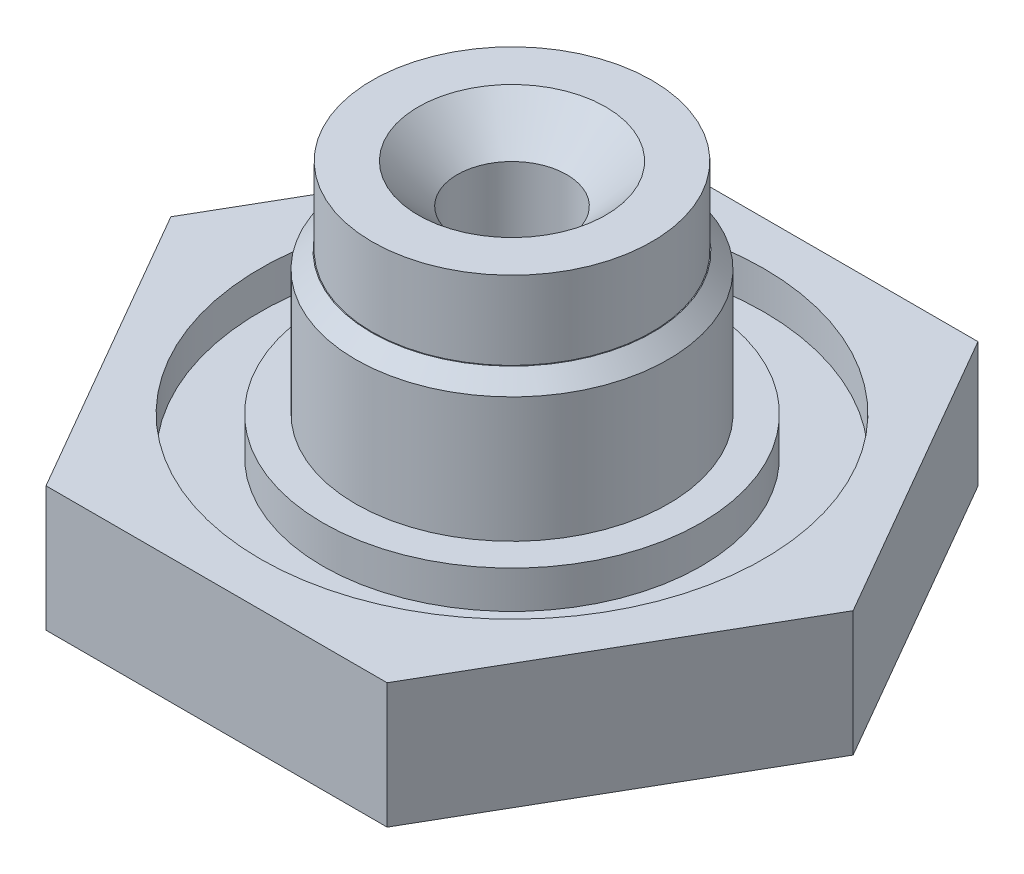
ISO-10303-21;
HEADER;
FILE_DESCRIPTION(('STEP AP214'),'2;1');
FILE_NAME('part.step','',(''),(''),'','','');
FILE_SCHEMA(('AUTOMOTIVE_DESIGN { 1 0 10303 214 1 1 1 1 }'));
ENDSEC;
DATA;
#1=APPLICATION_CONTEXT('core data for automotive mechanical design processes');
#2=APPLICATION_PROTOCOL_DEFINITION('international standard','automotive_design',2000,#1);
#3=PRODUCT_CONTEXT('',#1,'mechanical');
#4=PRODUCT('Part','Part','',(#3));
#5=PRODUCT_RELATED_PRODUCT_CATEGORY('part','',(#4));
#6=PRODUCT_DEFINITION_FORMATION('','',#4);
#7=PRODUCT_DEFINITION_CONTEXT('part definition',#1,'design');
#8=PRODUCT_DEFINITION('design','',#6,#7);
#9=PRODUCT_DEFINITION_SHAPE('','',#8);
#10=(LENGTH_UNIT() NAMED_UNIT(*) SI_UNIT(.MILLI.,.METRE.));
#11=(NAMED_UNIT(*) PLANE_ANGLE_UNIT() SI_UNIT($,.RADIAN.));
#12=(NAMED_UNIT(*) SI_UNIT($,.STERADIAN.) SOLID_ANGLE_UNIT());
#13=UNCERTAINTY_MEASURE_WITH_UNIT(LENGTH_MEASURE(1.E-05),#10,'distance_accuracy_value','');
#14=(GEOMETRIC_REPRESENTATION_CONTEXT(3) GLOBAL_UNCERTAINTY_ASSIGNED_CONTEXT((#13)) GLOBAL_UNIT_ASSIGNED_CONTEXT((#10,
#11,#12)) REPRESENTATION_CONTEXT('',''));
#15=CARTESIAN_POINT('',(0.,0.,0.));
#16=DIRECTION('',(0.,0.,1.));
#17=DIRECTION('',(1.,0.,0.));
#18=AXIS2_PLACEMENT_3D('',#15,#16,#17);
#19=CARTESIAN_POINT('',(5.,9.,0.));
#20=DIRECTION('',(0.,1.,0.));
#21=DIRECTION('',(0.,0.,1.));
#22=AXIS2_PLACEMENT_3D('',#19,#20,#21);
#23=PLANE('',#22);
#24=CARTESIAN_POINT('',(0.,9.,0.));
#25=DIRECTION('',(0.,-1.,0.));
#26=DIRECTION('',(0.,0.,-1.));
#27=AXIS2_PLACEMENT_3D('',#24,#25,#26);
#28=CIRCLE('',#27,5.);
#29=CARTESIAN_POINT('',(0.,9.,-5.));
#30=VERTEX_POINT('',#29);
#31=EDGE_CURVE('E132',#30,#30,#28,.T.);
#32=ORIENTED_EDGE('',*,*,#31,.T.);
#33=EDGE_LOOP('',(#32));
#34=FACE_BOUND('',#33,.T.);
#35=CARTESIAN_POINT('',(0.,9.,0.));
#36=DIRECTION('',(0.,1.,0.));
#37=DIRECTION('',(0.,0.,1.));
#38=AXIS2_PLACEMENT_3D('',#35,#36,#37);
#39=CIRCLE('',#38,6.05);
#40=CARTESIAN_POINT('',(0.,9.,6.05));
#41=VERTEX_POINT('',#40);
#42=EDGE_CURVE('E309',#41,#41,#39,.T.);
#43=ORIENTED_EDGE('',*,*,#42,.T.);
#44=EDGE_LOOP('',(#43));
#45=FACE_BOUND('',#44,.T.);
#46=ADVANCED_FACE('F38',(#34,#45),#23,.T.);
#47=CARTESIAN_POINT('',(0.,9.,0.));
#48=DIRECTION('',(0.,1.,0.));
#49=DIRECTION('',(0.,0.,1.));
#50=AXIS2_PLACEMENT_3D('',#47,#48,#49);
#51=CIRCLE('',#50,8.05);
#52=CARTESIAN_POINT('',(0.,9.,8.05));
#53=VERTEX_POINT('',#52);
#54=EDGE_CURVE('E311',#53,#53,#51,.T.);
#55=ORIENTED_EDGE('',*,*,#54,.F.);
#56=EDGE_LOOP('',(#55));
#57=FACE_BOUND('',#56,.T.);
#58=DIRECTION('',(-0.500000000000004,0.,0.866025403784436));
#59=VECTOR('',#58,1.);
#60=CARTESIAN_POINT('',(-10.911920087684,9.,0.));
#61=LINE('',#60,#59);
#62=CARTESIAN_POINT('',(-5.45596004384195,9.,-9.45000000000004));
#63=VERTEX_POINT('',#62);
#64=CARTESIAN_POINT('',(-10.911920087684,9.,0.));
#65=VERTEX_POINT('',#64);
#66=EDGE_CURVE('E120',#63,#65,#61,.T.);
#67=ORIENTED_EDGE('',*,*,#66,.T.);
#68=DIRECTION('',(0.499999999999998,0.,0.86602540378444));
#69=VECTOR('',#68,1.);
#70=CARTESIAN_POINT('',(-5.45596004384195,9.,9.45000000000004));
#71=LINE('',#70,#69);
#72=CARTESIAN_POINT('',(-5.45596004384195,9.,9.45000000000004));
#73=VERTEX_POINT('',#72);
#74=EDGE_CURVE('E115',#65,#73,#71,.T.);
#75=ORIENTED_EDGE('',*,*,#74,.T.);
#76=DIRECTION('',(1.,0.,0.));
#77=VECTOR('',#76,1.);
#78=CARTESIAN_POINT('',(5.45596004384196,9.,9.45000000000004));
#79=LINE('',#78,#77);
#80=CARTESIAN_POINT('',(5.45596004384196,9.,9.45000000000004));
#81=VERTEX_POINT('',#80);
#82=EDGE_CURVE('E113',#73,#81,#79,.T.);
#83=ORIENTED_EDGE('',*,*,#82,.T.);
#84=DIRECTION('',(0.500000000000004,0.,-0.866025403784436));
#85=VECTOR('',#84,1.);
#86=CARTESIAN_POINT('',(10.911920087684,9.,0.));
#87=LINE('',#86,#85);
#88=CARTESIAN_POINT('',(10.911920087684,9.,0.));
#89=VERTEX_POINT('',#88);
#90=EDGE_CURVE('E53',#81,#89,#87,.T.);
#91=ORIENTED_EDGE('',*,*,#90,.T.);
#92=DIRECTION('',(-0.499999999999998,0.,-0.86602540378444));
#93=VECTOR('',#92,1.);
#94=CARTESIAN_POINT('',(5.45596004384196,9.,-9.45000000000004));
#95=LINE('',#94,#93);
#96=CARTESIAN_POINT('',(5.45596004384196,9.,-9.45000000000004));
#97=VERTEX_POINT('',#96);
#98=EDGE_CURVE('E101',#89,#97,#95,.T.);
#99=ORIENTED_EDGE('',*,*,#98,.T.);
#100=DIRECTION('',(-1.,0.,0.));
#101=VECTOR('',#100,1.);
#102=CARTESIAN_POINT('',(-5.45596004384195,9.,-9.45000000000004));
#103=LINE('',#102,#101);
#104=EDGE_CURVE('E107',#97,#63,#103,.T.);
#105=ORIENTED_EDGE('',*,*,#104,.T.);
#106=EDGE_LOOP('',(#67,#75,#83,#91,#99,#105));
#107=FACE_BOUND('',#106,.T.);
#108=ADVANCED_FACE('F111',(#57,#107),#23,.T.);
#109=CARTESIAN_POINT('',(12.5,5.,0.));
#110=DIRECTION('',(0.,-1.,0.));
#111=DIRECTION('',(0.,0.,-1.));
#112=AXIS2_PLACEMENT_3D('',#109,#110,#111);
#113=PLANE('',#112);
#114=CARTESIAN_POINT('',(0.,5.,0.));
#115=DIRECTION('',(0.,-1.,0.));
#116=DIRECTION('',(0.,0.,-1.));
#117=AXIS2_PLACEMENT_3D('',#114,#115,#116);
#118=CIRCLE('',#117,5.64999999999998);
#119=CARTESIAN_POINT('',(0.,5.,5.64999999999998));
#120=VERTEX_POINT('',#119);
#121=EDGE_CURVE('E124',#120,#120,#118,.T.);
#122=ORIENTED_EDGE('',*,*,#121,.F.);
#123=EDGE_LOOP('',(#122));
#124=FACE_BOUND('',#123,.T.);
#125=DIRECTION('',(-1.,0.,0.));
#126=VECTOR('',#125,1.);
#127=CARTESIAN_POINT('',(12.5,5.,9.45000000000004));
#128=LINE('',#127,#126);
#129=CARTESIAN_POINT('',(5.45596004384196,5.,9.45000000000004));
#130=VERTEX_POINT('',#129);
#131=CARTESIAN_POINT('',(-5.45596004384195,5.,9.45000000000004));
#132=VERTEX_POINT('',#131);
#133=EDGE_CURVE('E162',#130,#132,#128,.T.);
#134=ORIENTED_EDGE('',*,*,#133,.T.);
#135=DIRECTION('',(-0.499999999999998,0.,-0.86602540378444));
#136=VECTOR('',#135,1.);
#137=CARTESIAN_POINT('',(-5.05894006576298,5.,10.1376587736527));
#138=LINE('',#137,#136);
#139=CARTESIAN_POINT('',(-10.911920087684,5.,0.));
#140=VERTEX_POINT('',#139);
#141=EDGE_CURVE('E11',#132,#140,#138,.T.);
#142=ORIENTED_EDGE('',*,*,#141,.T.);
#143=DIRECTION('',(0.500000000000004,0.,-0.866025403784436));
#144=VECTOR('',#143,1.);
#145=CARTESIAN_POINT('',(-5.0589400657629,5.,-10.1376587736528));
#146=LINE('',#145,#144);
#147=CARTESIAN_POINT('',(-5.45596004384195,5.,-9.45000000000004));
#148=VERTEX_POINT('',#147);
#149=EDGE_CURVE('E46',#140,#148,#146,.T.);
#150=ORIENTED_EDGE('',*,*,#149,.T.);
#151=DIRECTION('',(1.,0.,0.));
#152=VECTOR('',#151,1.);
#153=CARTESIAN_POINT('',(12.5,5.,-9.45000000000004));
#154=LINE('',#153,#152);
#155=CARTESIAN_POINT('',(5.45596004384196,5.,-9.45000000000004));
#156=VERTEX_POINT('',#155);
#157=EDGE_CURVE('E168',#148,#156,#154,.T.);
#158=ORIENTED_EDGE('',*,*,#157,.T.);
#159=DIRECTION('',(0.499999999999998,0.,0.86602540378444));
#160=VECTOR('',#159,1.);
#161=CARTESIAN_POINT('',(11.3089400657629,5.,0.687658773652745));
#162=LINE('',#161,#160);
#163=CARTESIAN_POINT('',(10.911920087684,5.,0.));
#164=VERTEX_POINT('',#163);
#165=EDGE_CURVE('E166',#156,#164,#162,.T.);
#166=ORIENTED_EDGE('',*,*,#165,.T.);
#167=DIRECTION('',(-0.500000000000004,0.,0.866025403784436));
#168=VECTOR('',#167,1.);
#169=CARTESIAN_POINT('',(11.308940065763,5.,-0.687658773652709));
#170=LINE('',#169,#168);
#171=EDGE_CURVE('E94',#164,#130,#170,.T.);
#172=ORIENTED_EDGE('',*,*,#171,.T.);
#173=EDGE_LOOP('',(#134,#142,#150,#158,#166,#172));
#174=FACE_BOUND('',#173,.T.);
#175=ADVANCED_FACE('F172',(#124,#174),#113,.T.);
#176=CARTESIAN_POINT('',(0.,0.,0.));
#177=DIRECTION('',(0.,1.,0.));
#178=DIRECTION('',(0.,0.,1.));
#179=AXIS2_PLACEMENT_3D('',#176,#177,#178);
#180=CONICAL_SURFACE('',#179,0.65,0.785398163397446);
#181=CARTESIAN_POINT('',(0.,0.,0.));
#182=DIRECTION('',(0.,-1.,0.));
#183=DIRECTION('',(0.,0.,-1.));
#184=AXIS2_PLACEMENT_3D('',#181,#182,#183);
#185=CIRCLE('',#184,0.65);
#186=CARTESIAN_POINT('',(0.,0.,0.65));
#187=VERTEX_POINT('',#186);
#188=EDGE_CURVE('E153',#187,#187,#185,.T.);
#189=CARTESIAN_POINT('',(0.,5.,5.64999999999998));
#190=CARTESIAN_POINT('',(0.,4.94791666666667,5.59791666666665));
#191=CARTESIAN_POINT('',(0.,4.89583333333333,5.54583333333331));
#192=CARTESIAN_POINT('',(0.,4.79166666666667,5.44166666666665));
#193=CARTESIAN_POINT('',(0.,4.73958333333333,5.38958333333331));
#194=CARTESIAN_POINT('',(0.,4.63541666666667,5.28541666666665));
#195=CARTESIAN_POINT('',(0.,4.58333333333333,5.23333333333331));
#196=CARTESIAN_POINT('',(0.,4.47916666666667,5.12916666666665));
#197=CARTESIAN_POINT('',(0.,4.42708333333333,5.07708333333332));
#198=CARTESIAN_POINT('',(0.,4.32291666666667,4.97291666666665));
#199=CARTESIAN_POINT('',(0.,4.27083333333333,4.92083333333332));
#200=CARTESIAN_POINT('',(0.,4.16666666666667,4.81666666666665));
#201=CARTESIAN_POINT('',(0.,4.11458333333333,4.76458333333332));
#202=CARTESIAN_POINT('',(0.,4.01041666666667,4.66041666666665));
#203=CARTESIAN_POINT('',(0.,3.95833333333333,4.60833333333332));
#204=CARTESIAN_POINT('',(0.,3.85416666666667,4.50416666666665));
#205=CARTESIAN_POINT('',(0.,3.80208333333333,4.45208333333332));
#206=CARTESIAN_POINT('',(0.,3.69791666666667,4.34791666666665));
#207=CARTESIAN_POINT('',(0.,3.64583333333333,4.29583333333332));
#208=CARTESIAN_POINT('',(0.,3.54166666666667,4.19166666666665));
#209=CARTESIAN_POINT('',(0.,3.48958333333333,4.13958333333332));
#210=CARTESIAN_POINT('',(0.,3.38541666666667,4.03541666666665));
#211=CARTESIAN_POINT('',(0.,3.33333333333333,3.98333333333332));
#212=CARTESIAN_POINT('',(0.,3.22916666666667,3.87916666666665));
#213=CARTESIAN_POINT('',(0.,3.17708333333333,3.82708333333332));
#214=CARTESIAN_POINT('',(0.,3.07291666666667,3.72291666666665));
#215=CARTESIAN_POINT('',(0.,3.02083333333333,3.67083333333332));
#216=CARTESIAN_POINT('',(0.,2.91666666666667,3.56666666666665));
#217=CARTESIAN_POINT('',(0.,2.86458333333333,3.51458333333332));
#218=CARTESIAN_POINT('',(0.,2.76041666666667,3.41041666666666));
#219=CARTESIAN_POINT('',(0.,2.70833333333333,3.35833333333332));
#220=CARTESIAN_POINT('',(0.,2.60416666666667,3.25416666666666));
#221=CARTESIAN_POINT('',(0.,2.55208333333333,3.20208333333332));
#222=CARTESIAN_POINT('',(0.,2.44791666666667,3.09791666666666));
#223=CARTESIAN_POINT('',(0.,2.39583333333333,3.04583333333332));
#224=CARTESIAN_POINT('',(0.,2.29166666666667,2.94166666666666));
#225=CARTESIAN_POINT('',(0.,2.23958333333333,2.88958333333332));
#226=CARTESIAN_POINT('',(0.,2.13541666666667,2.78541666666666));
#227=CARTESIAN_POINT('',(0.,2.08333333333333,2.73333333333332));
#228=CARTESIAN_POINT('',(0.,1.97916666666667,2.62916666666666));
#229=CARTESIAN_POINT('',(0.,1.92708333333333,2.57708333333333));
#230=CARTESIAN_POINT('',(0.,1.82291666666667,2.47291666666666));
#231=CARTESIAN_POINT('',(0.,1.77083333333333,2.42083333333333));
#232=CARTESIAN_POINT('',(0.,1.66666666666667,2.31666666666666));
#233=CARTESIAN_POINT('',(0.,1.61458333333333,2.26458333333333));
#234=CARTESIAN_POINT('',(0.,1.51041666666667,2.16041666666666));
#235=CARTESIAN_POINT('',(0.,1.45833333333333,2.10833333333333));
#236=CARTESIAN_POINT('',(0.,1.35416666666667,2.00416666666666));
#237=CARTESIAN_POINT('',(0.,1.30208333333333,1.95208333333333));
#238=CARTESIAN_POINT('',(0.,1.19791666666667,1.84791666666666));
#239=CARTESIAN_POINT('',(0.,1.14583333333333,1.79583333333333));
#240=CARTESIAN_POINT('',(0.,1.04166666666667,1.69166666666666));
#241=CARTESIAN_POINT('',(0.,0.989583333333333,1.63958333333333));
#242=CARTESIAN_POINT('',(0.,0.885416666666667,1.53541666666666));
#243=CARTESIAN_POINT('',(0.,0.833333333333333,1.48333333333333));
#244=CARTESIAN_POINT('',(0.,0.729166666666667,1.37916666666666));
#245=CARTESIAN_POINT('',(0.,0.677083333333334,1.32708333333333));
#246=CARTESIAN_POINT('',(0.,0.572916666666667,1.22291666666666));
#247=CARTESIAN_POINT('',(0.,0.520833333333334,1.17083333333333));
#248=CARTESIAN_POINT('',(0.,0.416666666666667,1.06666666666667));
#249=CARTESIAN_POINT('',(0.,0.364583333333334,1.01458333333333));
#250=CARTESIAN_POINT('',(0.,0.260416666666667,0.910416666666666));
#251=CARTESIAN_POINT('',(0.,0.208333333333334,0.858333333333333));
#252=CARTESIAN_POINT('',(0.,0.104166666666667,0.754166666666666));
#253=CARTESIAN_POINT('',(0.,0.0520833333333334,0.702083333333333));
#254=CARTESIAN_POINT('',(0.,0.,0.65));
#255=B_SPLINE_CURVE_WITH_KNOTS('',3,(#189,#190,#191,#192,#193,#194,#195,#196,#197,#198,#199,
#200,#201,#202,#203,#204,#205,#206,#207,#208,#209,#210,#211,#212,#213,#214,#215,#216,#217,#218,
#219,#220,#221,#222,#223,#224,#225,#226,#227,#228,#229,#230,#231,#232,#233,#234,#235,#236,#237,
#238,#239,#240,#241,#242,#243,#244,#245,#246,#247,#248,#249,#250,#251,#252,#253,#254),
.UNSPECIFIED.,.F.,.F.,(4,2,2,2,2,2,2,2,2,2,2,2,2,2,2,2,2,2,2,2,2,2,2,2,2,2,2,2,2,2,2,2,4),(0.,
0.220970869120796,0.441941738241591,0.662912607362388,0.883883476483183,1.10485434560398,
1.32582521472477,1.54679608384557,1.76776695296636,1.98873782208716,2.20970869120796,
2.43067956032875,2.65165042944955,2.87262129857034,3.09359216769114,3.31456303681194,
3.53553390593273,3.75650477505353,3.97747564417432,4.19844651329512,4.41941738241591,
4.64038825153671,4.8613591206575,5.0823299897783,5.3033008588991,5.52427172801989,
5.74524259714069,5.96621346626148,6.18718433538228,6.40815520450307,6.62912607362387,
6.85009694274467,7.07106781186546),.UNSPECIFIED.);
#256=EDGE_CURVE('BSEAM234',#120,#187,#255,.T.);
#257=ORIENTED_EDGE('',*,*,#121,.T.);
#258=ORIENTED_EDGE('',*,*,#188,.F.);
#259=ORIENTED_EDGE('',*,*,#256,.T.);
#260=ORIENTED_EDGE('',*,*,#256,.F.);
#261=EDGE_LOOP('',(#257,#259,#258,#260));
#262=FACE_BOUND('',#261,.T.);
#263=ADVANCED_FACE('F234',(#262),#180,.T.);
#264=CARTESIAN_POINT('',(0.,0.,0.));
#265=DIRECTION('',(0.,-1.,0.));
#266=DIRECTION('',(0.,0.,-1.));
#267=AXIS2_PLACEMENT_3D('',#264,#265,#266);
#268=CYLINDRICAL_SURFACE('',#267,0.65);
#269=ORIENTED_EDGE('',*,*,#188,.T.);
#270=EDGE_LOOP('',(#269));
#271=FACE_BOUND('',#270,.T.);
#272=CARTESIAN_POINT('',(0.,1.5,0.));
#273=DIRECTION('',(0.,-1.,0.));
#274=DIRECTION('',(0.,0.,-1.));
#275=AXIS2_PLACEMENT_3D('',#272,#273,#274);
#276=CIRCLE('',#275,0.65);
#277=CARTESIAN_POINT('',(0.,1.5,-0.65));
#278=VERTEX_POINT('',#277);
#279=EDGE_CURVE('E150',#278,#278,#276,.T.);
#280=ORIENTED_EDGE('',*,*,#279,.F.);
#281=EDGE_LOOP('',(#280));
#282=FACE_BOUND('',#281,.T.);
#283=ADVANCED_FACE('F231',(#271,#282),#268,.F.);
#284=CARTESIAN_POINT('',(0.,2.6,0.));
#285=DIRECTION('',(0.,1.,0.));
#286=DIRECTION('',(0.,0.,1.));
#287=AXIS2_PLACEMENT_3D('',#284,#285,#286);
#288=CONICAL_SURFACE('',#287,1.75,0.78539816339745);
#289=ORIENTED_EDGE('',*,*,#279,.T.);
#290=EDGE_LOOP('',(#289));
#291=FACE_BOUND('',#290,.T.);
#292=CARTESIAN_POINT('',(0.,2.6,0.));
#293=DIRECTION('',(0.,-1.,0.));
#294=DIRECTION('',(0.,0.,-1.));
#295=AXIS2_PLACEMENT_3D('',#292,#293,#294);
#296=CIRCLE('',#295,1.75);
#297=CARTESIAN_POINT('',(0.,2.6,-1.75));
#298=VERTEX_POINT('',#297);
#299=EDGE_CURVE('E147',#298,#298,#296,.T.);
#300=ORIENTED_EDGE('',*,*,#299,.F.);
#301=EDGE_LOOP('',(#300));
#302=FACE_BOUND('',#301,.T.);
#303=ADVANCED_FACE('F227',(#291,#302),#288,.F.);
#304=CARTESIAN_POINT('',(0.,0.,0.));
#305=DIRECTION('',(0.,-1.,0.));
#306=DIRECTION('',(0.,0.,-1.));
#307=AXIS2_PLACEMENT_3D('',#304,#305,#306);
#308=CYLINDRICAL_SURFACE('',#307,1.75);
#309=ORIENTED_EDGE('',*,*,#299,.T.);
#310=EDGE_LOOP('',(#309));
#311=FACE_BOUND('',#310,.T.);
#312=CARTESIAN_POINT('',(0.,14.75,0.));
#313=DIRECTION('',(0.,-1.,0.));
#314=DIRECTION('',(0.,0.,-1.));
#315=AXIS2_PLACEMENT_3D('',#312,#313,#314);
#316=CIRCLE('',#315,1.75);
#317=CARTESIAN_POINT('',(0.,14.75,-1.75));
#318=VERTEX_POINT('',#317);
#319=EDGE_CURVE('E144',#318,#318,#316,.T.);
#320=ORIENTED_EDGE('',*,*,#319,.F.);
#321=EDGE_LOOP('',(#320));
#322=FACE_BOUND('',#321,.T.);
#323=ADVANCED_FACE('F223',(#311,#322),#308,.F.);
#324=CARTESIAN_POINT('',(0.,16.,0.));
#325=DIRECTION('',(0.,1.,0.));
#326=DIRECTION('',(0.,0.,1.));
#327=AXIS2_PLACEMENT_3D('',#324,#325,#326);
#328=CONICAL_SURFACE('',#327,3.,0.785398163397449);
#329=ORIENTED_EDGE('',*,*,#319,.T.);
#330=EDGE_LOOP('',(#329));
#331=FACE_BOUND('',#330,.T.);
#332=CARTESIAN_POINT('',(0.,16.,0.));
#333=DIRECTION('',(0.,-1.,0.));
#334=DIRECTION('',(0.,0.,-1.));
#335=AXIS2_PLACEMENT_3D('',#332,#333,#334);
#336=CIRCLE('',#335,3.);
#337=CARTESIAN_POINT('',(0.,16.,-3.));
#338=VERTEX_POINT('',#337);
#339=EDGE_CURVE('E141',#338,#338,#336,.T.);
#340=ORIENTED_EDGE('',*,*,#339,.F.);
#341=EDGE_LOOP('',(#340));
#342=FACE_BOUND('',#341,.T.);
#343=ADVANCED_FACE('F219',(#331,#342),#328,.F.);
#344=CARTESIAN_POINT('',(3.,16.,0.));
#345=DIRECTION('',(0.,1.,0.));
#346=DIRECTION('',(0.,0.,1.));
#347=AXIS2_PLACEMENT_3D('',#344,#345,#346);
#348=PLANE('',#347);
#349=ORIENTED_EDGE('',*,*,#339,.T.);
#350=EDGE_LOOP('',(#349));
#351=FACE_BOUND('',#350,.T.);
#352=CARTESIAN_POINT('',(0.,16.,0.));
#353=DIRECTION('',(0.,-1.,0.));
#354=DIRECTION('',(0.,0.,-1.));
#355=AXIS2_PLACEMENT_3D('',#352,#353,#354);
#356=CIRCLE('',#355,4.475);
#357=CARTESIAN_POINT('',(0.,16.,-4.475));
#358=VERTEX_POINT('',#357);
#359=EDGE_CURVE('E138',#358,#358,#356,.T.);
#360=ORIENTED_EDGE('',*,*,#359,.F.);
#361=EDGE_LOOP('',(#360));
#362=FACE_BOUND('',#361,.T.);
#363=ADVANCED_FACE('F215',(#351,#362),#348,.T.);
#364=CARTESIAN_POINT('',(0.,0.,0.));
#365=DIRECTION('',(0.,-1.,0.));
#366=DIRECTION('',(0.,0.,-1.));
#367=AXIS2_PLACEMENT_3D('',#364,#365,#366);
#368=CYLINDRICAL_SURFACE('',#367,4.475);
#369=ORIENTED_EDGE('',*,*,#359,.T.);
#370=EDGE_LOOP('',(#369));
#371=FACE_BOUND('',#370,.T.);
#372=CARTESIAN_POINT('',(0.,13.5,0.));
#373=DIRECTION('',(0.,-1.,0.));
#374=DIRECTION('',(0.,0.,-1.));
#375=AXIS2_PLACEMENT_3D('',#372,#373,#374);
#376=CIRCLE('',#375,4.475);
#377=CARTESIAN_POINT('',(0.,13.5,-4.475));
#378=VERTEX_POINT('',#377);
#379=EDGE_CURVE('E135',#378,#378,#376,.T.);
#380=ORIENTED_EDGE('',*,*,#379,.F.);
#381=EDGE_LOOP('',(#380));
#382=FACE_BOUND('',#381,.T.);
#383=ADVANCED_FACE('F211',(#371,#382),#368,.T.);
#384=CARTESIAN_POINT('',(4.475,13.5,0.));
#385=DIRECTION('',(0.,1.,0.));
#386=DIRECTION('',(0.,0.,1.));
#387=AXIS2_PLACEMENT_3D('',#384,#385,#386);
#388=PLANE('',#387);
#389=CARTESIAN_POINT('',(0.,13.5,0.));
#390=DIRECTION('',(0.,1.,0.));
#391=DIRECTION('',(0.,0.,1.));
#392=AXIS2_PLACEMENT_3D('',#389,#390,#391);
#393=CIRCLE('',#392,4.5);
#394=CARTESIAN_POINT('',(0.,13.5,4.5));
#395=VERTEX_POINT('',#394);
#396=EDGE_CURVE('E159',#395,#395,#393,.T.);
#397=ORIENTED_EDGE('',*,*,#396,.T.);
#398=EDGE_LOOP('',(#397));
#399=FACE_BOUND('',#398,.T.);
#400=ORIENTED_EDGE('',*,*,#379,.T.);
#401=EDGE_LOOP('',(#400));
#402=FACE_BOUND('',#401,.T.);
#403=ADVANCED_FACE('F207',(#399,#402),#388,.T.);
#404=CARTESIAN_POINT('',(0.,0.,0.));
#405=DIRECTION('',(0.,-1.,0.));
#406=DIRECTION('',(0.,0.,-1.));
#407=AXIS2_PLACEMENT_3D('',#404,#405,#406);
#408=CYLINDRICAL_SURFACE('',#407,5.);
#409=CARTESIAN_POINT('',(0.,13.,0.));
#410=DIRECTION('',(0.,1.,0.));
#411=DIRECTION('',(0.,0.,1.));
#412=AXIS2_PLACEMENT_3D('',#409,#410,#411);
#413=CIRCLE('',#412,5.);
#414=CARTESIAN_POINT('',(0.,13.,5.));
#415=VERTEX_POINT('',#414);
#416=EDGE_CURVE('E156',#415,#415,#413,.F.);
#417=ORIENTED_EDGE('',*,*,#416,.T.);
#418=EDGE_LOOP('',(#417));
#419=FACE_BOUND('',#418,.T.);
#420=ORIENTED_EDGE('',*,*,#31,.F.);
#421=EDGE_LOOP('',(#420));
#422=FACE_BOUND('',#421,.T.);
#423=ADVANCED_FACE('F204',(#419,#422),#408,.T.);
#424=CARTESIAN_POINT('',(0.,13.,0.));
#425=DIRECTION('',(0.,-1.,0.));
#426=DIRECTION('',(0.,0.,-1.));
#427=AXIS2_PLACEMENT_3D('',#424,#425,#426);
#428=CONICAL_SURFACE('',#427,5.,0.785398163397448);
#429=ORIENTED_EDGE('',*,*,#396,.F.);
#430=EDGE_LOOP('',(#429));
#431=FACE_BOUND('',#430,.T.);
#432=ORIENTED_EDGE('',*,*,#416,.F.);
#433=EDGE_LOOP('',(#432));
#434=FACE_BOUND('',#433,.T.);
#435=ADVANCED_FACE('F40',(#431,#434),#428,.T.);
#436=CARTESIAN_POINT('',(-5.45596004384195,0.,9.45000000000004));
#437=DIRECTION('',(-0.86602540378444,0.,0.499999999999998));
#438=DIRECTION('',(0.499999999999998,0.,0.86602540378444));
#439=AXIS2_PLACEMENT_3D('',#436,#437,#438);
#440=PLANE('',#439);
#441=DIRECTION('',(0.,1.,0.));
#442=VECTOR('',#441,1.);
#443=CARTESIAN_POINT('',(-5.45596004384195,0.,9.45000000000004));
#444=LINE('',#443,#442);
#445=EDGE_CURVE('E61',#132,#73,#444,.T.);
#446=ORIENTED_EDGE('',*,*,#445,.T.);
#447=ORIENTED_EDGE('',*,*,#74,.F.);
#448=DIRECTION('',(0.,1.,0.));
#449=VECTOR('',#448,1.);
#450=CARTESIAN_POINT('',(-10.911920087684,0.,0.));
#451=LINE('',#450,#449);
#452=EDGE_CURVE('E122',#140,#65,#451,.T.);
#453=ORIENTED_EDGE('',*,*,#452,.F.);
#454=ORIENTED_EDGE('',*,*,#141,.F.);
#455=EDGE_LOOP('',(#446,#447,#453,#454));
#456=FACE_BOUND('',#455,.T.);
#457=ADVANCED_FACE('F180',(#456),#440,.T.);
#458=CARTESIAN_POINT('',(-10.911920087684,0.,0.));
#459=DIRECTION('',(-0.866025403784436,0.,-0.500000000000004));
#460=DIRECTION('',(-0.500000000000004,0.,0.866025403784436));
#461=AXIS2_PLACEMENT_3D('',#458,#459,#460);
#462=PLANE('',#461);
#463=ORIENTED_EDGE('',*,*,#452,.T.);
#464=ORIENTED_EDGE('',*,*,#66,.F.);
#465=DIRECTION('',(0.,1.,0.));
#466=VECTOR('',#465,1.);
#467=CARTESIAN_POINT('',(-5.45596004384195,0.,-9.45000000000004));
#468=LINE('',#467,#466);
#469=EDGE_CURVE('E125',#148,#63,#468,.T.);
#470=ORIENTED_EDGE('',*,*,#469,.F.);
#471=ORIENTED_EDGE('',*,*,#149,.F.);
#472=EDGE_LOOP('',(#463,#464,#470,#471));
#473=FACE_BOUND('',#472,.T.);
#474=ADVANCED_FACE('F176',(#473),#462,.T.);
#475=CARTESIAN_POINT('',(-5.45596004384195,0.,-9.45000000000004));
#476=DIRECTION('',(0.,0.,-1.));
#477=DIRECTION('',(-1.,0.,0.));
#478=AXIS2_PLACEMENT_3D('',#475,#476,#477);
#479=PLANE('',#478);
#480=ORIENTED_EDGE('',*,*,#469,.T.);
#481=ORIENTED_EDGE('',*,*,#104,.F.);
#482=DIRECTION('',(0.,1.,0.));
#483=VECTOR('',#482,1.);
#484=CARTESIAN_POINT('',(5.45596004384196,0.,-9.45000000000004));
#485=LINE('',#484,#483);
#486=EDGE_CURVE('E97',#156,#97,#485,.T.);
#487=ORIENTED_EDGE('',*,*,#486,.F.);
#488=ORIENTED_EDGE('',*,*,#157,.F.);
#489=EDGE_LOOP('',(#480,#481,#487,#488));
#490=FACE_BOUND('',#489,.T.);
#491=ADVANCED_FACE('F183',(#490),#479,.T.);
#492=CARTESIAN_POINT('',(5.45596004384196,0.,-9.45000000000004));
#493=DIRECTION('',(0.86602540378444,0.,-0.499999999999998));
#494=DIRECTION('',(-0.499999999999998,0.,-0.86602540378444));
#495=AXIS2_PLACEMENT_3D('',#492,#493,#494);
#496=PLANE('',#495);
#497=ORIENTED_EDGE('',*,*,#486,.T.);
#498=ORIENTED_EDGE('',*,*,#98,.F.);
#499=DIRECTION('',(0.,1.,0.));
#500=VECTOR('',#499,1.);
#501=CARTESIAN_POINT('',(10.911920087684,0.,0.));
#502=LINE('',#501,#500);
#503=EDGE_CURVE('E90',#164,#89,#502,.T.);
#504=ORIENTED_EDGE('',*,*,#503,.F.);
#505=ORIENTED_EDGE('',*,*,#165,.F.);
#506=EDGE_LOOP('',(#497,#498,#504,#505));
#507=FACE_BOUND('',#506,.T.);
#508=ADVANCED_FACE('F102',(#507),#496,.T.);
#509=CARTESIAN_POINT('',(10.911920087684,0.,0.));
#510=DIRECTION('',(0.866025403784436,0.,0.500000000000004));
#511=DIRECTION('',(0.500000000000004,0.,-0.866025403784436));
#512=AXIS2_PLACEMENT_3D('',#509,#510,#511);
#513=PLANE('',#512);
#514=ORIENTED_EDGE('',*,*,#503,.T.);
#515=ORIENTED_EDGE('',*,*,#90,.F.);
#516=DIRECTION('',(0.,1.,0.));
#517=VECTOR('',#516,1.);
#518=CARTESIAN_POINT('',(5.45596004384196,0.,9.45000000000004));
#519=LINE('',#518,#517);
#520=EDGE_CURVE('E98',#130,#81,#519,.T.);
#521=ORIENTED_EDGE('',*,*,#520,.F.);
#522=ORIENTED_EDGE('',*,*,#171,.F.);
#523=EDGE_LOOP('',(#514,#515,#521,#522));
#524=FACE_BOUND('',#523,.T.);
#525=ADVANCED_FACE('F92',(#524),#513,.T.);
#526=CARTESIAN_POINT('',(5.45596004384196,0.,9.45000000000004));
#527=DIRECTION('',(0.,0.,1.));
#528=DIRECTION('',(1.,0.,0.));
#529=AXIS2_PLACEMENT_3D('',#526,#527,#528);
#530=PLANE('',#529);
#531=ORIENTED_EDGE('',*,*,#520,.T.);
#532=ORIENTED_EDGE('',*,*,#82,.F.);
#533=ORIENTED_EDGE('',*,*,#445,.F.);
#534=ORIENTED_EDGE('',*,*,#133,.F.);
#535=EDGE_LOOP('',(#531,#532,#533,#534));
#536=FACE_BOUND('',#535,.T.);
#537=ADVANCED_FACE('F278',(#536),#530,.T.);
#538=CARTESIAN_POINT('',(0.,7.8,0.));
#539=DIRECTION('',(0.,1.,0.));
#540=DIRECTION('',(0.,0.,1.));
#541=AXIS2_PLACEMENT_3D('',#538,#539,#540);
#542=CYLINDRICAL_SURFACE('',#541,8.05);
#543=CARTESIAN_POINT('',(0.,7.8,0.));
#544=DIRECTION('',(0.,1.,0.));
#545=DIRECTION('',(0.,0.,1.));
#546=AXIS2_PLACEMENT_3D('',#543,#544,#545);
#547=CIRCLE('',#546,8.05);
#548=CARTESIAN_POINT('',(0.,7.8,8.05));
#549=VERTEX_POINT('',#548);
#550=EDGE_CURVE('E181',#549,#549,#547,.T.);
#551=ORIENTED_EDGE('',*,*,#550,.F.);
#552=EDGE_LOOP('',(#551));
#553=FACE_BOUND('',#552,.T.);
#554=ORIENTED_EDGE('',*,*,#54,.T.);
#555=EDGE_LOOP('',(#554));
#556=FACE_BOUND('',#555,.T.);
#557=ADVANCED_FACE('F272',(#553,#556),#542,.F.);
#558=CARTESIAN_POINT('',(0.,7.8,0.));
#559=DIRECTION('',(0.,1.,0.));
#560=DIRECTION('',(0.,0.,1.));
#561=AXIS2_PLACEMENT_3D('',#558,#559,#560);
#562=PLANE('',#561);
#563=CARTESIAN_POINT('',(0.,7.8,0.));
#564=DIRECTION('',(0.,1.,0.));
#565=DIRECTION('',(0.,0.,1.));
#566=AXIS2_PLACEMENT_3D('',#563,#564,#565);
#567=CIRCLE('',#566,6.05);
#568=CARTESIAN_POINT('',(0.,7.8,6.05));
#569=VERTEX_POINT('',#568);
#570=EDGE_CURVE('E306',#569,#569,#567,.T.);
#571=ORIENTED_EDGE('',*,*,#570,.F.);
#572=EDGE_LOOP('',(#571));
#573=FACE_BOUND('',#572,.T.);
#574=ORIENTED_EDGE('',*,*,#550,.T.);
#575=EDGE_LOOP('',(#574));
#576=FACE_BOUND('',#575,.T.);
#577=ADVANCED_FACE('F277',(#573,#576),#562,.T.);
#578=CARTESIAN_POINT('',(0.,7.8,0.));
#579=DIRECTION('',(0.,1.,0.));
#580=DIRECTION('',(0.,0.,1.));
#581=AXIS2_PLACEMENT_3D('',#578,#579,#580);
#582=CYLINDRICAL_SURFACE('',#581,6.05);
#583=ORIENTED_EDGE('',*,*,#570,.T.);
#584=EDGE_LOOP('',(#583));
#585=FACE_BOUND('',#584,.T.);
#586=ORIENTED_EDGE('',*,*,#42,.F.);
#587=EDGE_LOOP('',(#586));
#588=FACE_BOUND('',#587,.T.);
#589=ADVANCED_FACE('F289',(#585,#588),#582,.T.);
#590=CLOSED_SHELL('',(#46,#108,#175,#263,#283,#303,#323,#343,#363,#383,#403,#423,#435,#457,#474,
#491,#508,#525,#537,#557,#577,#589));
#591=MANIFOLD_SOLID_BREP('B2',#590);
#592=ADVANCED_BREP_SHAPE_REPRESENTATION('',(#18,#591),#14);
#593=SHAPE_DEFINITION_REPRESENTATION(#9,#592);
ENDSEC;
END-ISO-10303-21;
